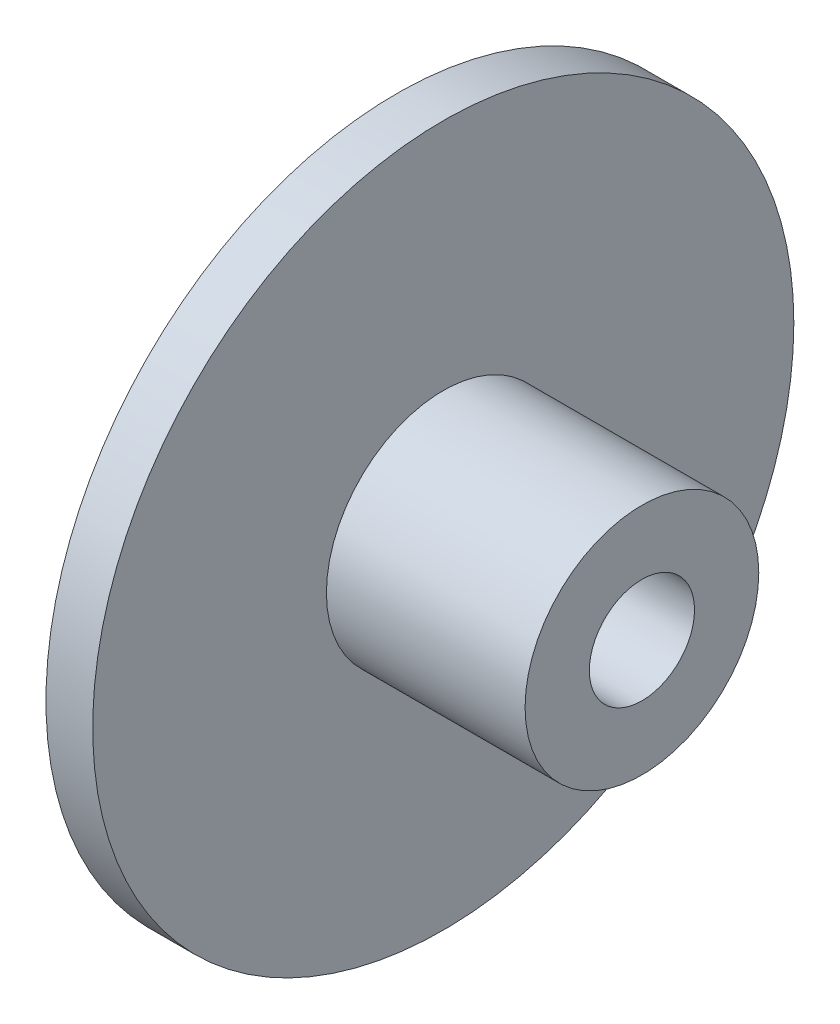
ISO-10303-21;
HEADER;
FILE_DESCRIPTION(('STEP AP214'),'2;1');
FILE_NAME('part.step','',(''),(''),'','','');
FILE_SCHEMA(('AUTOMOTIVE_DESIGN { 1 0 10303 214 1 1 1 1 }'));
ENDSEC;
DATA;
#1=APPLICATION_CONTEXT('core data for automotive mechanical design processes');
#2=APPLICATION_PROTOCOL_DEFINITION('international standard','automotive_design',2000,#1);
#3=PRODUCT_CONTEXT('',#1,'mechanical');
#4=PRODUCT('Part','Part','',(#3));
#5=PRODUCT_RELATED_PRODUCT_CATEGORY('part','',(#4));
#6=PRODUCT_DEFINITION_FORMATION('','',#4);
#7=PRODUCT_DEFINITION_CONTEXT('part definition',#1,'design');
#8=PRODUCT_DEFINITION('design','',#6,#7);
#9=PRODUCT_DEFINITION_SHAPE('','',#8);
#10=(LENGTH_UNIT() NAMED_UNIT(*) SI_UNIT(.MILLI.,.METRE.));
#11=(NAMED_UNIT(*) PLANE_ANGLE_UNIT() SI_UNIT($,.RADIAN.));
#12=(NAMED_UNIT(*) SI_UNIT($,.STERADIAN.) SOLID_ANGLE_UNIT());
#13=UNCERTAINTY_MEASURE_WITH_UNIT(LENGTH_MEASURE(1.E-05),#10,'distance_accuracy_value','');
#14=(GEOMETRIC_REPRESENTATION_CONTEXT(3) GLOBAL_UNCERTAINTY_ASSIGNED_CONTEXT((#13)) GLOBAL_UNIT_ASSIGNED_CONTEXT((#10,
#11,#12)) REPRESENTATION_CONTEXT('',''));
#15=CARTESIAN_POINT('',(0.,0.,0.));
#16=DIRECTION('',(0.,0.,1.));
#17=DIRECTION('',(1.,0.,0.));
#18=AXIS2_PLACEMENT_3D('',#15,#16,#17);
#19=CARTESIAN_POINT('',(2.,0.,0.));
#20=DIRECTION('',(-1.,0.,0.));
#21=DIRECTION('',(0.,0.,1.));
#22=AXIS2_PLACEMENT_3D('',#19,#20,#21);
#23=CYLINDRICAL_SURFACE('',#22,2.25);
#24=CARTESIAN_POINT('',(10.5,0.,0.));
#25=DIRECTION('',(1.,0.,0.));
#26=DIRECTION('',(0.,0.,-1.));
#27=AXIS2_PLACEMENT_3D('',#24,#25,#26);
#28=CIRCLE('',#27,2.25);
#29=CARTESIAN_POINT('',(10.5,0.,-2.25));
#30=VERTEX_POINT('',#29);
#31=EDGE_CURVE('E55',#30,#30,#28,.T.);
#32=ORIENTED_EDGE('',*,*,#31,.T.);
#33=EDGE_LOOP('',(#32));
#34=FACE_BOUND('',#33,.T.);
#35=CARTESIAN_POINT('',(4.,0.,0.));
#36=DIRECTION('',(-1.,0.,0.));
#37=DIRECTION('',(0.,0.,1.));
#38=AXIS2_PLACEMENT_3D('',#35,#36,#37);
#39=CIRCLE('',#38,2.25);
#40=CARTESIAN_POINT('',(4.,0.,2.25));
#41=VERTEX_POINT('',#40);
#42=EDGE_CURVE('E41',#41,#41,#39,.T.);
#43=ORIENTED_EDGE('',*,*,#42,.T.);
#44=EDGE_LOOP('',(#43));
#45=FACE_BOUND('',#44,.T.);
#46=ADVANCED_FACE('F37',(#34,#45),#23,.F.);
#47=CARTESIAN_POINT('',(2.,0.,0.));
#48=DIRECTION('',(1.,0.,0.));
#49=DIRECTION('',(0.,0.,-1.));
#50=AXIS2_PLACEMENT_3D('',#47,#48,#49);
#51=PLANE('',#50);
#52=CARTESIAN_POINT('',(2.,0.,0.));
#53=DIRECTION('',(1.,0.,0.));
#54=DIRECTION('',(0.,0.,-1.));
#55=AXIS2_PLACEMENT_3D('',#52,#53,#54);
#56=CIRCLE('',#55,15.);
#57=CARTESIAN_POINT('',(2.,0.,-15.));
#58=VERTEX_POINT('',#57);
#59=EDGE_CURVE('E10',#58,#58,#56,.T.);
#60=ORIENTED_EDGE('',*,*,#59,.T.);
#61=EDGE_LOOP('',(#60));
#62=FACE_BOUND('',#61,.T.);
#63=CARTESIAN_POINT('',(2.,0.,0.));
#64=DIRECTION('',(1.,0.,0.));
#65=DIRECTION('',(0.,0.,-1.));
#66=AXIS2_PLACEMENT_3D('',#63,#64,#65);
#67=CIRCLE('',#66,5.);
#68=CARTESIAN_POINT('',(2.,0.,-5.));
#69=VERTEX_POINT('',#68);
#70=EDGE_CURVE('E52',#69,#69,#67,.T.);
#71=ORIENTED_EDGE('',*,*,#70,.F.);
#72=EDGE_LOOP('',(#71));
#73=FACE_BOUND('',#72,.T.);
#74=ADVANCED_FACE('F82',(#62,#73),#51,.T.);
#75=CARTESIAN_POINT('',(0.,0.,0.));
#76=DIRECTION('',(1.,0.,0.));
#77=DIRECTION('',(0.,0.,-1.));
#78=AXIS2_PLACEMENT_3D('',#75,#76,#77);
#79=PLANE('',#78);
#80=CARTESIAN_POINT('',(0.,0.,0.));
#81=DIRECTION('',(-1.,0.,0.));
#82=DIRECTION('',(0.,0.,1.));
#83=AXIS2_PLACEMENT_3D('',#80,#81,#82);
#84=CIRCLE('',#83,3.75);
#85=CARTESIAN_POINT('',(0.,0.,3.75));
#86=VERTEX_POINT('',#85);
#87=EDGE_CURVE('E60',#86,#86,#84,.T.);
#88=ORIENTED_EDGE('',*,*,#87,.F.);
#89=EDGE_LOOP('',(#88));
#90=FACE_BOUND('',#89,.T.);
#91=CARTESIAN_POINT('',(0.,0.,0.));
#92=DIRECTION('',(1.,0.,0.));
#93=DIRECTION('',(0.,0.,-1.));
#94=AXIS2_PLACEMENT_3D('',#91,#92,#93);
#95=CIRCLE('',#94,15.);
#96=CARTESIAN_POINT('',(0.,0.,-15.));
#97=VERTEX_POINT('',#96);
#98=EDGE_CURVE('E45',#97,#97,#95,.T.);
#99=ORIENTED_EDGE('',*,*,#98,.F.);
#100=EDGE_LOOP('',(#99));
#101=FACE_BOUND('',#100,.T.);
#102=ADVANCED_FACE('F90',(#90,#101),#79,.F.);
#103=CARTESIAN_POINT('',(2.,0.,0.));
#104=DIRECTION('',(-1.,0.,0.));
#105=DIRECTION('',(0.,0.,1.));
#106=AXIS2_PLACEMENT_3D('',#103,#104,#105);
#107=CYLINDRICAL_SURFACE('',#106,15.);
#108=ORIENTED_EDGE('',*,*,#59,.F.);
#109=EDGE_LOOP('',(#108));
#110=FACE_BOUND('',#109,.T.);
#111=ORIENTED_EDGE('',*,*,#98,.T.);
#112=EDGE_LOOP('',(#111));
#113=FACE_BOUND('',#112,.T.);
#114=ADVANCED_FACE('F39',(#110,#113),#107,.T.);
#115=CARTESIAN_POINT('',(10.5,0.,0.));
#116=DIRECTION('',(1.,0.,0.));
#117=DIRECTION('',(0.,0.,-1.));
#118=AXIS2_PLACEMENT_3D('',#115,#116,#117);
#119=PLANE('',#118);
#120=CARTESIAN_POINT('',(10.5,0.,0.));
#121=DIRECTION('',(1.,0.,0.));
#122=DIRECTION('',(0.,0.,-1.));
#123=AXIS2_PLACEMENT_3D('',#120,#121,#122);
#124=CIRCLE('',#123,5.);
#125=CARTESIAN_POINT('',(10.5,0.,-5.));
#126=VERTEX_POINT('',#125);
#127=EDGE_CURVE('E50',#126,#126,#124,.T.);
#128=ORIENTED_EDGE('',*,*,#127,.T.);
#129=EDGE_LOOP('',(#128));
#130=FACE_BOUND('',#129,.T.);
#131=ORIENTED_EDGE('',*,*,#31,.F.);
#132=EDGE_LOOP('',(#131));
#133=FACE_BOUND('',#132,.T.);
#134=ADVANCED_FACE('F98',(#130,#133),#119,.T.);
#135=CARTESIAN_POINT('',(10.5,0.,0.));
#136=DIRECTION('',(-1.,0.,0.));
#137=DIRECTION('',(0.,0.,1.));
#138=AXIS2_PLACEMENT_3D('',#135,#136,#137);
#139=CYLINDRICAL_SURFACE('',#138,5.);
#140=ORIENTED_EDGE('',*,*,#127,.F.);
#141=EDGE_LOOP('',(#140));
#142=FACE_BOUND('',#141,.T.);
#143=ORIENTED_EDGE('',*,*,#70,.T.);
#144=EDGE_LOOP('',(#143));
#145=FACE_BOUND('',#144,.T.);
#146=ADVANCED_FACE('F78',(#142,#145),#139,.T.);
#147=CARTESIAN_POINT('',(4.,0.,0.));
#148=DIRECTION('',(-1.,0.,0.));
#149=DIRECTION('',(0.,0.,1.));
#150=AXIS2_PLACEMENT_3D('',#147,#148,#149);
#151=CYLINDRICAL_SURFACE('',#150,3.75);
#152=CARTESIAN_POINT('',(4.,0.,0.));
#153=DIRECTION('',(-1.,0.,0.));
#154=DIRECTION('',(0.,0.,1.));
#155=AXIS2_PLACEMENT_3D('',#152,#153,#154);
#156=CIRCLE('',#155,3.75);
#157=CARTESIAN_POINT('',(4.,0.,3.75));
#158=VERTEX_POINT('',#157);
#159=EDGE_CURVE('E63',#158,#158,#156,.T.);
#160=ORIENTED_EDGE('',*,*,#159,.F.);
#161=EDGE_LOOP('',(#160));
#162=FACE_BOUND('',#161,.T.);
#163=ORIENTED_EDGE('',*,*,#87,.T.);
#164=EDGE_LOOP('',(#163));
#165=FACE_BOUND('',#164,.T.);
#166=ADVANCED_FACE('F73',(#162,#165),#151,.F.);
#167=CARTESIAN_POINT('',(4.,0.,0.));
#168=DIRECTION('',(-1.,0.,0.));
#169=DIRECTION('',(0.,0.,1.));
#170=AXIS2_PLACEMENT_3D('',#167,#168,#169);
#171=PLANE('',#170);
#172=ORIENTED_EDGE('',*,*,#42,.F.);
#173=EDGE_LOOP('',(#172));
#174=FACE_BOUND('',#173,.T.);
#175=ORIENTED_EDGE('',*,*,#159,.T.);
#176=EDGE_LOOP('',(#175));
#177=FACE_BOUND('',#176,.T.);
#178=ADVANCED_FACE('F71',(#174,#177),#171,.T.);
#179=CLOSED_SHELL('',(#46,#74,#102,#114,#134,#146,#166,#178));
#180=MANIFOLD_SOLID_BREP('B2',#179);
#181=ADVANCED_BREP_SHAPE_REPRESENTATION('',(#18,#180),#14);
#182=SHAPE_DEFINITION_REPRESENTATION(#9,#181);
ENDSEC;
END-ISO-10303-21;
